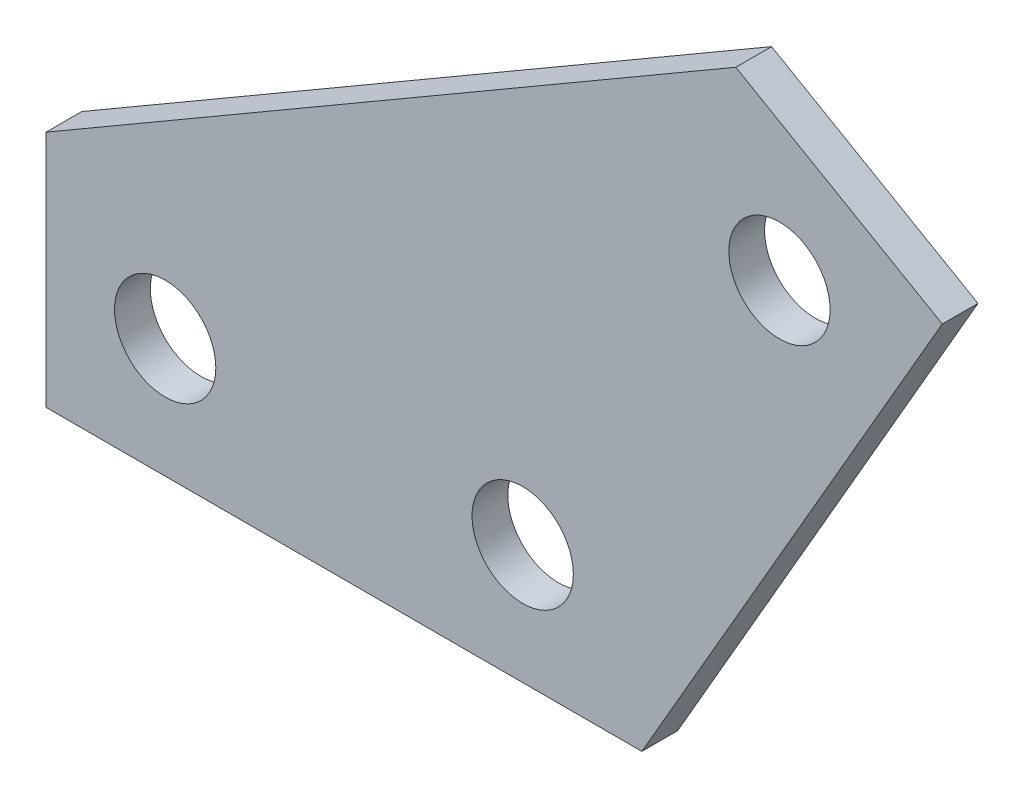
ISO-10303-21;
HEADER;
FILE_DESCRIPTION(('STEP AP214'),'2;1');
FILE_NAME('part.step','',(''),(''),'','','');
FILE_SCHEMA(('AUTOMOTIVE_DESIGN { 1 0 10303 214 1 1 1 1 }'));
ENDSEC;
DATA;
#1=APPLICATION_CONTEXT('core data for automotive mechanical design processes');
#2=APPLICATION_PROTOCOL_DEFINITION('international standard','automotive_design',2000,#1);
#3=PRODUCT_CONTEXT('',#1,'mechanical');
#4=PRODUCT('Part','Part','',(#3));
#5=PRODUCT_RELATED_PRODUCT_CATEGORY('part','',(#4));
#6=PRODUCT_DEFINITION_FORMATION('','',#4);
#7=PRODUCT_DEFINITION_CONTEXT('part definition',#1,'design');
#8=PRODUCT_DEFINITION('design','',#6,#7);
#9=PRODUCT_DEFINITION_SHAPE('','',#8);
#10=(LENGTH_UNIT() NAMED_UNIT(*) SI_UNIT(.MILLI.,.METRE.));
#11=(NAMED_UNIT(*) PLANE_ANGLE_UNIT() SI_UNIT($,.RADIAN.));
#12=(NAMED_UNIT(*) SI_UNIT($,.STERADIAN.) SOLID_ANGLE_UNIT());
#13=UNCERTAINTY_MEASURE_WITH_UNIT(LENGTH_MEASURE(1.E-05),#10,'distance_accuracy_value','');
#14=(GEOMETRIC_REPRESENTATION_CONTEXT(3) GLOBAL_UNCERTAINTY_ASSIGNED_CONTEXT((#13)) GLOBAL_UNIT_ASSIGNED_CONTEXT((#10,
#11,#12)) REPRESENTATION_CONTEXT('',''));
#15=CARTESIAN_POINT('',(0.,0.,0.));
#16=DIRECTION('',(0.,0.,1.));
#17=DIRECTION('',(1.,0.,0.));
#18=AXIS2_PLACEMENT_3D('',#15,#16,#17);
#19=CARTESIAN_POINT('',(0.,0.,3.));
#20=DIRECTION('',(0.,0.,-1.));
#21=DIRECTION('',(-1.,0.,0.));
#22=AXIS2_PLACEMENT_3D('',#19,#20,#21);
#23=PLANE('',#22);
#24=DIRECTION('',(1.,0.,0.));
#25=VECTOR('',#24,1.);
#26=CARTESIAN_POINT('',(0.,0.,3.));
#27=LINE('',#26,#25);
#28=CARTESIAN_POINT('',(0.,0.,3.));
#29=VERTEX_POINT('',#28);
#30=CARTESIAN_POINT('',(50.,0.,3.));
#31=VERTEX_POINT('',#30);
#32=EDGE_CURVE('E137',#29,#31,#27,.T.);
#33=ORIENTED_EDGE('',*,*,#32,.T.);
#34=DIRECTION('',(0.499999999999998,0.86602540378444,0.));
#35=VECTOR('',#34,1.);
#36=CARTESIAN_POINT('',(50.,0.,3.));
#37=LINE('',#36,#35);
#38=CARTESIAN_POINT('',(75.2072594216367,43.6602540378443,3.));
#39=VERTEX_POINT('',#38);
#40=EDGE_CURVE('E95',#31,#39,#37,.T.);
#41=ORIENTED_EDGE('',*,*,#40,.T.);
#42=DIRECTION('',(-0.866025403784441,0.499999999999995,0.));
#43=VECTOR('',#42,1.);
#44=CARTESIAN_POINT('',(75.2072594216367,43.6602540378443,3.));
#45=LINE('',#44,#43);
#46=CARTESIAN_POINT('',(57.8867513459479,53.6602540378442,3.));
#47=VERTEX_POINT('',#46);
#48=EDGE_CURVE('E99',#39,#47,#45,.T.);
#49=ORIENTED_EDGE('',*,*,#48,.T.);
#50=DIRECTION('',(-0.864473662012175,-0.502678115385243,0.));
#51=VECTOR('',#50,1.);
#52=CARTESIAN_POINT('',(0.,20.,3.));
#53=LINE('',#52,#51);
#54=CARTESIAN_POINT('',(0.,20.,3.));
#55=VERTEX_POINT('',#54);
#56=EDGE_CURVE('E103',#47,#55,#53,.T.);
#57=ORIENTED_EDGE('',*,*,#56,.T.);
#58=DIRECTION('',(0.,-1.,0.));
#59=VECTOR('',#58,1.);
#60=CARTESIAN_POINT('',(0.,20.,3.));
#61=LINE('',#60,#59);
#62=EDGE_CURVE('E61',#55,#29,#61,.T.);
#63=ORIENTED_EDGE('',*,*,#62,.T.);
#64=EDGE_LOOP('',(#33,#41,#49,#57,#63));
#65=FACE_BOUND('',#64,.T.);
#66=CARTESIAN_POINT('',(40.,9.99999999999999,3.));
#67=DIRECTION('',(0.,0.,1.));
#68=DIRECTION('',(1.,0.,0.));
#69=AXIS2_PLACEMENT_3D('',#66,#67,#68);
#70=CIRCLE('',#69,4.25);
#71=CARTESIAN_POINT('',(44.25,9.99999999999999,3.));
#72=VERTEX_POINT('',#71);
#73=EDGE_CURVE('E128',#72,#72,#70,.T.);
#74=ORIENTED_EDGE('',*,*,#73,.F.);
#75=EDGE_LOOP('',(#74));
#76=FACE_BOUND('',#75,.T.);
#77=CARTESIAN_POINT('',(10.,9.99999999999999,3.));
#78=DIRECTION('',(0.,0.,1.));
#79=DIRECTION('',(1.,0.,0.));
#80=AXIS2_PLACEMENT_3D('',#77,#78,#79);
#81=CIRCLE('',#80,4.25);
#82=CARTESIAN_POINT('',(14.25,9.99999999999999,3.));
#83=VERTEX_POINT('',#82);
#84=EDGE_CURVE('E191',#83,#83,#81,.T.);
#85=ORIENTED_EDGE('',*,*,#84,.F.);
#86=EDGE_LOOP('',(#85));
#87=FACE_BOUND('',#86,.T.);
#88=CARTESIAN_POINT('',(61.5470053837924,40.,3.));
#89=DIRECTION('',(0.,0.,1.));
#90=DIRECTION('',(1.,0.,0.));
#91=AXIS2_PLACEMENT_3D('',#88,#89,#90);
#92=CIRCLE('',#91,4.25000000000001);
#93=CARTESIAN_POINT('',(65.7970053837924,40.,3.));
#94=VERTEX_POINT('',#93);
#95=EDGE_CURVE('E180',#94,#94,#92,.T.);
#96=ORIENTED_EDGE('',*,*,#95,.F.);
#97=EDGE_LOOP('',(#96));
#98=FACE_BOUND('',#97,.T.);
#99=ADVANCED_FACE('F43',(#65,#76,#87,#98),#23,.F.);
#100=CARTESIAN_POINT('',(0.,0.,0.));
#101=DIRECTION('',(0.,0.,-1.));
#102=DIRECTION('',(-1.,0.,0.));
#103=AXIS2_PLACEMENT_3D('',#100,#101,#102);
#104=PLANE('',#103);
#105=CARTESIAN_POINT('',(10.,9.99999999999999,0.));
#106=DIRECTION('',(0.,0.,1.));
#107=DIRECTION('',(1.,0.,0.));
#108=AXIS2_PLACEMENT_3D('',#105,#106,#107);
#109=CIRCLE('',#108,4.25);
#110=CARTESIAN_POINT('',(14.25,9.99999999999999,0.));
#111=VERTEX_POINT('',#110);
#112=EDGE_CURVE('E188',#111,#111,#109,.T.);
#113=ORIENTED_EDGE('',*,*,#112,.T.);
#114=EDGE_LOOP('',(#113));
#115=FACE_BOUND('',#114,.T.);
#116=DIRECTION('',(1.,0.,0.));
#117=VECTOR('',#116,1.);
#118=CARTESIAN_POINT('',(0.,0.,0.));
#119=LINE('',#118,#117);
#120=CARTESIAN_POINT('',(0.,0.,0.));
#121=VERTEX_POINT('',#120);
#122=CARTESIAN_POINT('',(50.,0.,0.));
#123=VERTEX_POINT('',#122);
#124=EDGE_CURVE('E123',#121,#123,#119,.T.);
#125=ORIENTED_EDGE('',*,*,#124,.F.);
#126=DIRECTION('',(0.,-1.,0.));
#127=VECTOR('',#126,1.);
#128=CARTESIAN_POINT('',(0.,20.,0.));
#129=LINE('',#128,#127);
#130=CARTESIAN_POINT('',(0.,20.,0.));
#131=VERTEX_POINT('',#130);
#132=EDGE_CURVE('E87',#131,#121,#129,.T.);
#133=ORIENTED_EDGE('',*,*,#132,.F.);
#134=DIRECTION('',(-0.864473662012175,-0.502678115385243,0.));
#135=VECTOR('',#134,1.);
#136=CARTESIAN_POINT('',(0.,20.,0.));
#137=LINE('',#136,#135);
#138=CARTESIAN_POINT('',(57.8867513459479,53.6602540378442,0.));
#139=VERTEX_POINT('',#138);
#140=EDGE_CURVE('E81',#139,#131,#137,.T.);
#141=ORIENTED_EDGE('',*,*,#140,.F.);
#142=DIRECTION('',(-0.866025403784441,0.499999999999995,0.));
#143=VECTOR('',#142,1.);
#144=CARTESIAN_POINT('',(75.2072594216367,43.6602540378443,0.));
#145=LINE('',#144,#143);
#146=CARTESIAN_POINT('',(75.2072594216367,43.6602540378443,0.));
#147=VERTEX_POINT('',#146);
#148=EDGE_CURVE('E111',#147,#139,#145,.T.);
#149=ORIENTED_EDGE('',*,*,#148,.F.);
#150=DIRECTION('',(0.499999999999998,0.86602540378444,0.));
#151=VECTOR('',#150,1.);
#152=CARTESIAN_POINT('',(50.,0.,0.));
#153=LINE('',#152,#151);
#154=EDGE_CURVE('E127',#123,#147,#153,.T.);
#155=ORIENTED_EDGE('',*,*,#154,.F.);
#156=EDGE_LOOP('',(#125,#133,#141,#149,#155));
#157=FACE_BOUND('',#156,.T.);
#158=CARTESIAN_POINT('',(40.,9.99999999999999,0.));
#159=DIRECTION('',(0.,0.,1.));
#160=DIRECTION('',(1.,0.,0.));
#161=AXIS2_PLACEMENT_3D('',#158,#159,#160);
#162=CIRCLE('',#161,4.25);
#163=CARTESIAN_POINT('',(44.25,9.99999999999999,0.));
#164=VERTEX_POINT('',#163);
#165=EDGE_CURVE('E195',#164,#164,#162,.T.);
#166=ORIENTED_EDGE('',*,*,#165,.T.);
#167=EDGE_LOOP('',(#166));
#168=FACE_BOUND('',#167,.T.);
#169=CARTESIAN_POINT('',(61.5470053837924,40.,0.));
#170=DIRECTION('',(0.,0.,1.));
#171=DIRECTION('',(1.,0.,0.));
#172=AXIS2_PLACEMENT_3D('',#169,#170,#171);
#173=CIRCLE('',#172,4.25000000000001);
#174=CARTESIAN_POINT('',(65.7970053837924,40.,0.));
#175=VERTEX_POINT('',#174);
#176=EDGE_CURVE('E183',#175,#175,#173,.T.);
#177=ORIENTED_EDGE('',*,*,#176,.T.);
#178=EDGE_LOOP('',(#177));
#179=FACE_BOUND('',#178,.T.);
#180=ADVANCED_FACE('F144',(#115,#157,#168,#179),#104,.T.);
#181=CARTESIAN_POINT('',(0.,0.,3.));
#182=DIRECTION('',(0.,1.,0.));
#183=DIRECTION('',(-1.,0.,0.));
#184=AXIS2_PLACEMENT_3D('',#181,#182,#183);
#185=PLANE('',#184);
#186=ORIENTED_EDGE('',*,*,#124,.T.);
#187=DIRECTION('',(0.,0.,-1.));
#188=VECTOR('',#187,1.);
#189=CARTESIAN_POINT('',(50.,0.,3.));
#190=LINE('',#189,#188);
#191=EDGE_CURVE('E11',#31,#123,#190,.T.);
#192=ORIENTED_EDGE('',*,*,#191,.F.);
#193=ORIENTED_EDGE('',*,*,#32,.F.);
#194=DIRECTION('',(0.,0.,-1.));
#195=VECTOR('',#194,1.);
#196=CARTESIAN_POINT('',(0.,0.,3.));
#197=LINE('',#196,#195);
#198=EDGE_CURVE('E119',#29,#121,#197,.T.);
#199=ORIENTED_EDGE('',*,*,#198,.T.);
#200=EDGE_LOOP('',(#186,#192,#193,#199));
#201=FACE_BOUND('',#200,.T.);
#202=ADVANCED_FACE('F45',(#201),#185,.F.);
#203=CARTESIAN_POINT('',(50.,0.,3.));
#204=DIRECTION('',(-0.86602540378444,0.499999999999998,0.));
#205=DIRECTION('',(-0.499999999999998,-0.86602540378444,0.));
#206=AXIS2_PLACEMENT_3D('',#203,#204,#205);
#207=PLANE('',#206);
#208=ORIENTED_EDGE('',*,*,#154,.T.);
#209=DIRECTION('',(0.,0.,-1.));
#210=VECTOR('',#209,1.);
#211=CARTESIAN_POINT('',(75.2072594216367,43.6602540378443,3.));
#212=LINE('',#211,#210);
#213=EDGE_CURVE('E53',#39,#147,#212,.T.);
#214=ORIENTED_EDGE('',*,*,#213,.F.);
#215=ORIENTED_EDGE('',*,*,#40,.F.);
#216=ORIENTED_EDGE('',*,*,#191,.T.);
#217=EDGE_LOOP('',(#208,#214,#215,#216));
#218=FACE_BOUND('',#217,.T.);
#219=ADVANCED_FACE('F245',(#218),#207,.F.);
#220=CARTESIAN_POINT('',(75.2072594216367,43.6602540378443,3.));
#221=DIRECTION('',(-0.499999999999995,-0.866025403784441,0.));
#222=DIRECTION('',(0.866025403784441,-0.499999999999995,0.));
#223=AXIS2_PLACEMENT_3D('',#220,#221,#222);
#224=PLANE('',#223);
#225=ORIENTED_EDGE('',*,*,#148,.T.);
#226=DIRECTION('',(0.,0.,-1.));
#227=VECTOR('',#226,1.);
#228=CARTESIAN_POINT('',(57.8867513459479,53.6602540378442,3.));
#229=LINE('',#228,#227);
#230=EDGE_CURVE('E108',#47,#139,#229,.T.);
#231=ORIENTED_EDGE('',*,*,#230,.F.);
#232=ORIENTED_EDGE('',*,*,#48,.F.);
#233=ORIENTED_EDGE('',*,*,#213,.T.);
#234=EDGE_LOOP('',(#225,#231,#232,#233));
#235=FACE_BOUND('',#234,.T.);
#236=ADVANCED_FACE('F109',(#235),#224,.F.);
#237=CARTESIAN_POINT('',(0.,20.,3.));
#238=DIRECTION('',(0.502678115385243,-0.864473662012175,0.));
#239=DIRECTION('',(0.864473662012175,0.502678115385243,0.));
#240=AXIS2_PLACEMENT_3D('',#237,#238,#239);
#241=PLANE('',#240);
#242=ORIENTED_EDGE('',*,*,#140,.T.);
#243=DIRECTION('',(0.,0.,-1.));
#244=VECTOR('',#243,1.);
#245=CARTESIAN_POINT('',(0.,20.,3.));
#246=LINE('',#245,#244);
#247=EDGE_CURVE('E113',#55,#131,#246,.T.);
#248=ORIENTED_EDGE('',*,*,#247,.F.);
#249=ORIENTED_EDGE('',*,*,#56,.F.);
#250=ORIENTED_EDGE('',*,*,#230,.T.);
#251=EDGE_LOOP('',(#242,#248,#249,#250));
#252=FACE_BOUND('',#251,.T.);
#253=ADVANCED_FACE('F115',(#252),#241,.F.);
#254=CARTESIAN_POINT('',(0.,20.,3.));
#255=DIRECTION('',(1.,0.,0.));
#256=DIRECTION('',(0.,0.,-1.));
#257=AXIS2_PLACEMENT_3D('',#254,#255,#256);
#258=PLANE('',#257);
#259=ORIENTED_EDGE('',*,*,#132,.T.);
#260=ORIENTED_EDGE('',*,*,#198,.F.);
#261=ORIENTED_EDGE('',*,*,#62,.F.);
#262=ORIENTED_EDGE('',*,*,#247,.T.);
#263=EDGE_LOOP('',(#259,#260,#261,#262));
#264=FACE_BOUND('',#263,.T.);
#265=ADVANCED_FACE('F149',(#264),#258,.F.);
#266=CARTESIAN_POINT('',(40.,9.99999999999999,3.));
#267=DIRECTION('',(0.,0.,-1.));
#268=DIRECTION('',(-1.,0.,0.));
#269=AXIS2_PLACEMENT_3D('',#266,#267,#268);
#270=CYLINDRICAL_SURFACE('',#269,4.25);
#271=ORIENTED_EDGE('',*,*,#73,.T.);
#272=EDGE_LOOP('',(#271));
#273=FACE_BOUND('',#272,.T.);
#274=ORIENTED_EDGE('',*,*,#165,.F.);
#275=EDGE_LOOP('',(#274));
#276=FACE_BOUND('',#275,.T.);
#277=ADVANCED_FACE('F151',(#273,#276),#270,.F.);
#278=CARTESIAN_POINT('',(10.,9.99999999999999,3.));
#279=DIRECTION('',(0.,0.,-1.));
#280=DIRECTION('',(-1.,0.,0.));
#281=AXIS2_PLACEMENT_3D('',#278,#279,#280);
#282=CYLINDRICAL_SURFACE('',#281,4.25);
#283=ORIENTED_EDGE('',*,*,#84,.T.);
#284=EDGE_LOOP('',(#283));
#285=FACE_BOUND('',#284,.T.);
#286=ORIENTED_EDGE('',*,*,#112,.F.);
#287=EDGE_LOOP('',(#286));
#288=FACE_BOUND('',#287,.T.);
#289=ADVANCED_FACE('F157',(#285,#288),#282,.F.);
#290=CARTESIAN_POINT('',(61.5470053837924,40.,3.));
#291=DIRECTION('',(0.,0.,-1.));
#292=DIRECTION('',(-1.,0.,0.));
#293=AXIS2_PLACEMENT_3D('',#290,#291,#292);
#294=CYLINDRICAL_SURFACE('',#293,4.25000000000001);
#295=ORIENTED_EDGE('',*,*,#95,.T.);
#296=EDGE_LOOP('',(#295));
#297=FACE_BOUND('',#296,.T.);
#298=ORIENTED_EDGE('',*,*,#176,.F.);
#299=EDGE_LOOP('',(#298));
#300=FACE_BOUND('',#299,.T.);
#301=ADVANCED_FACE('F171',(#297,#300),#294,.F.);
#302=CLOSED_SHELL('',(#99,#180,#202,#219,#236,#253,#265,#277,#289,#301));
#303=MANIFOLD_SOLID_BREP('B2',#302);
#304=ADVANCED_BREP_SHAPE_REPRESENTATION('',(#18,#303),#14);
#305=SHAPE_DEFINITION_REPRESENTATION(#9,#304);
ENDSEC;
END-ISO-10303-21;
